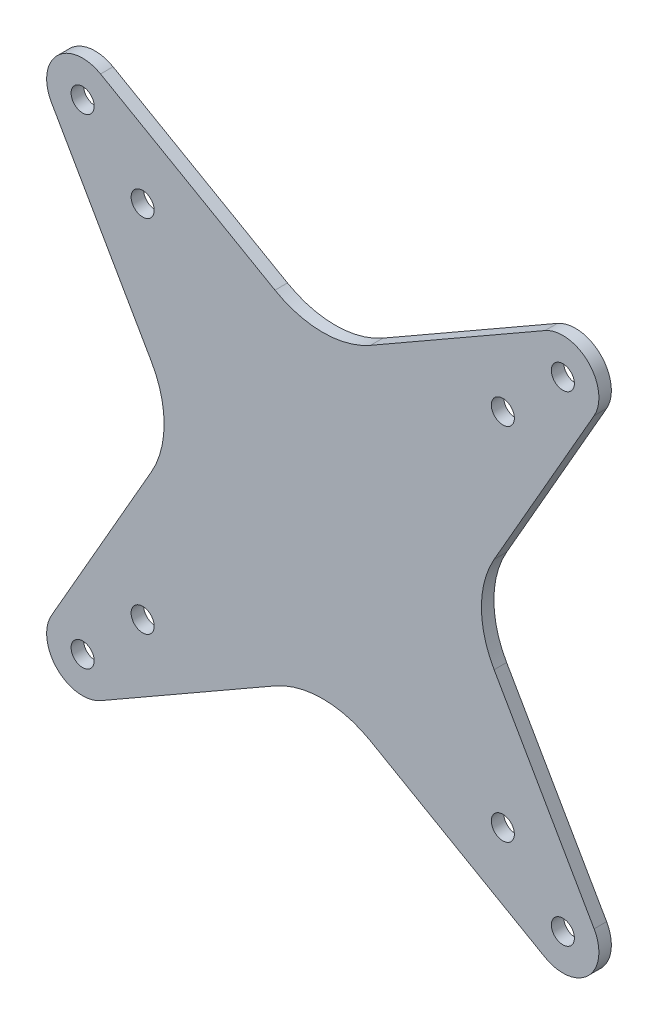
ISO-10303-21;
HEADER;
FILE_DESCRIPTION(('STEP AP214'),'2;1');
FILE_NAME('part.step','',(''),(''),'','','');
FILE_SCHEMA(('AUTOMOTIVE_DESIGN { 1 0 10303 214 1 1 1 1 }'));
ENDSEC;
DATA;
#1=APPLICATION_CONTEXT('core data for automotive mechanical design processes');
#2=APPLICATION_PROTOCOL_DEFINITION('international standard','automotive_design',2000,#1);
#3=PRODUCT_CONTEXT('',#1,'mechanical');
#4=PRODUCT('Part','Part','',(#3));
#5=PRODUCT_RELATED_PRODUCT_CATEGORY('part','',(#4));
#6=PRODUCT_DEFINITION_FORMATION('','',#4);
#7=PRODUCT_DEFINITION_CONTEXT('part definition',#1,'design');
#8=PRODUCT_DEFINITION('design','',#6,#7);
#9=PRODUCT_DEFINITION_SHAPE('','',#8);
#10=(LENGTH_UNIT() NAMED_UNIT(*) SI_UNIT(.MILLI.,.METRE.));
#11=(NAMED_UNIT(*) PLANE_ANGLE_UNIT() SI_UNIT($,.RADIAN.));
#12=(NAMED_UNIT(*) SI_UNIT($,.STERADIAN.) SOLID_ANGLE_UNIT());
#13=UNCERTAINTY_MEASURE_WITH_UNIT(LENGTH_MEASURE(1.E-05),#10,'distance_accuracy_value','');
#14=(GEOMETRIC_REPRESENTATION_CONTEXT(3) GLOBAL_UNCERTAINTY_ASSIGNED_CONTEXT((#13)) GLOBAL_UNIT_ASSIGNED_CONTEXT((#10,
#11,#12)) REPRESENTATION_CONTEXT('',''));
#15=CARTESIAN_POINT('',(0.,0.,0.));
#16=DIRECTION('',(0.,0.,1.));
#17=DIRECTION('',(1.,0.,0.));
#18=AXIS2_PLACEMENT_3D('',#15,#16,#17);
#19=CARTESIAN_POINT('',(0.,0.,2.6));
#20=DIRECTION('',(0.,0.,1.));
#21=DIRECTION('',(1.,0.,0.));
#22=AXIS2_PLACEMENT_3D('',#19,#20,#21);
#23=PLANE('',#22);
#24=CARTESIAN_POINT('',(-50.,50.,2.6));
#25=DIRECTION('',(0.,0.,-1.));
#26=DIRECTION('',(-1.,0.,0.));
#27=AXIS2_PLACEMENT_3D('',#24,#25,#26);
#28=CIRCLE('',#27,2.4);
#29=CARTESIAN_POINT('',(-52.4,50.,2.6));
#30=VERTEX_POINT('',#29);
#31=EDGE_CURVE('E316',#30,#30,#28,.T.);
#32=ORIENTED_EDGE('',*,*,#31,.T.);
#33=EDGE_LOOP('',(#32));
#34=FACE_BOUND('',#33,.T.);
#35=CARTESIAN_POINT('',(-37.5,37.5,2.6));
#36=DIRECTION('',(0.,0.,-1.));
#37=DIRECTION('',(-1.,0.,0.));
#38=AXIS2_PLACEMENT_3D('',#35,#36,#37);
#39=CIRCLE('',#38,2.4);
#40=CARTESIAN_POINT('',(-39.9,37.5,2.6));
#41=VERTEX_POINT('',#40);
#42=EDGE_CURVE('E326',#41,#41,#39,.T.);
#43=ORIENTED_EDGE('',*,*,#42,.T.);
#44=EDGE_LOOP('',(#43));
#45=FACE_BOUND('',#44,.T.);
#46=CARTESIAN_POINT('',(37.5,37.5,2.6));
#47=DIRECTION('',(0.,0.,-1.));
#48=DIRECTION('',(-1.,0.,0.));
#49=AXIS2_PLACEMENT_3D('',#46,#47,#48);
#50=CIRCLE('',#49,2.4);
#51=CARTESIAN_POINT('',(35.1,37.5,2.6));
#52=VERTEX_POINT('',#51);
#53=EDGE_CURVE('E332',#52,#52,#50,.T.);
#54=ORIENTED_EDGE('',*,*,#53,.T.);
#55=EDGE_LOOP('',(#54));
#56=FACE_BOUND('',#55,.T.);
#57=CARTESIAN_POINT('',(50.,50.,2.6));
#58=DIRECTION('',(0.,0.,-1.));
#59=DIRECTION('',(-1.,0.,0.));
#60=AXIS2_PLACEMENT_3D('',#57,#58,#59);
#61=CIRCLE('',#60,2.4);
#62=CARTESIAN_POINT('',(47.6,50.,2.6));
#63=VERTEX_POINT('',#62);
#64=EDGE_CURVE('E338',#63,#63,#61,.T.);
#65=ORIENTED_EDGE('',*,*,#64,.T.);
#66=EDGE_LOOP('',(#65));
#67=FACE_BOUND('',#66,.T.);
#68=CARTESIAN_POINT('',(50.,-50.,2.6));
#69=DIRECTION('',(0.,0.,-1.));
#70=DIRECTION('',(-1.,0.,0.));
#71=AXIS2_PLACEMENT_3D('',#68,#69,#70);
#72=CIRCLE('',#71,2.4);
#73=CARTESIAN_POINT('',(47.6,-50.,2.6));
#74=VERTEX_POINT('',#73);
#75=EDGE_CURVE('E344',#74,#74,#72,.T.);
#76=ORIENTED_EDGE('',*,*,#75,.T.);
#77=EDGE_LOOP('',(#76));
#78=FACE_BOUND('',#77,.T.);
#79=CARTESIAN_POINT('',(0.,-53.0330085889911,2.6));
#80=DIRECTION('',(0.,0.,1.));
#81=DIRECTION('',(1.,0.,0.));
#82=AXIS2_PLACEMENT_3D('',#79,#80,#81);
#83=CIRCLE('',#82,20.);
#84=CARTESIAN_POINT('',(9.94750286480512,-35.6822971697238,2.6));
#85=VERTEX_POINT('',#84);
#86=CARTESIAN_POINT('',(-9.94750286480512,-35.6822971697238,2.6));
#87=VERTEX_POINT('',#86);
#88=EDGE_CURVE('E224',#85,#87,#83,.T.);
#89=ORIENTED_EDGE('',*,*,#88,.F.);
#90=DIRECTION('',(-0.867535570963367,0.497375143240256,0.));
#91=VECTOR('',#90,1.);
#92=CARTESIAN_POINT('',(-12.9357433623348,-22.5628836828659,2.6));
#93=LINE('',#92,#91);
#94=CARTESIAN_POINT('',(46.2696864256981,-56.5065167822253,2.6));
#95=VERTEX_POINT('',#94);
#96=EDGE_CURVE('E262',#95,#85,#93,.T.);
#97=ORIENTED_EDGE('',*,*,#96,.F.);
#98=CARTESIAN_POINT('',(50.,-50.,2.6));
#99=DIRECTION('',(0.,0.,1.));
#100=DIRECTION('',(1.,0.,0.));
#101=AXIS2_PLACEMENT_3D('',#98,#99,#100);
#102=CIRCLE('',#101,7.50000000000001);
#103=CARTESIAN_POINT('',(56.5065167822252,-46.2696864256981,2.6));
#104=VERTEX_POINT('',#103);
#105=EDGE_CURVE('E252',#95,#104,#102,.T.);
#106=ORIENTED_EDGE('',*,*,#105,.T.);
#107=DIRECTION('',(0.497375143240257,-0.867535570963366,0.));
#108=VECTOR('',#107,1.);
#109=CARTESIAN_POINT('',(22.5628836828658,12.9357433623347,2.6));
#110=LINE('',#109,#108);
#111=CARTESIAN_POINT('',(35.6822971697237,-9.94750286480515,2.6));
#112=VERTEX_POINT('',#111);
#113=EDGE_CURVE('E367',#112,#104,#110,.T.);
#114=ORIENTED_EDGE('',*,*,#113,.F.);
#115=CARTESIAN_POINT('',(53.0330085889911,0.,2.6));
#116=DIRECTION('',(0.,0.,1.));
#117=DIRECTION('',(1.,0.,0.));
#118=AXIS2_PLACEMENT_3D('',#115,#116,#117);
#119=CIRCLE('',#118,20.);
#120=CARTESIAN_POINT('',(35.6822971697237,9.94750286480512,2.6));
#121=VERTEX_POINT('',#120);
#122=EDGE_CURVE('E370',#121,#112,#119,.T.);
#123=ORIENTED_EDGE('',*,*,#122,.F.);
#124=DIRECTION('',(-0.497375143240257,-0.867535570963367,0.));
#125=VECTOR('',#124,1.);
#126=CARTESIAN_POINT('',(22.5628836828659,-12.9357433623347,2.6));
#127=LINE('',#126,#125);
#128=CARTESIAN_POINT('',(56.5065167822252,46.2696864256981,2.6));
#129=VERTEX_POINT('',#128);
#130=EDGE_CURVE('E373',#129,#121,#127,.T.);
#131=ORIENTED_EDGE('',*,*,#130,.F.);
#132=CARTESIAN_POINT('',(50.,50.,2.6));
#133=DIRECTION('',(0.,0.,1.));
#134=DIRECTION('',(1.,0.,0.));
#135=AXIS2_PLACEMENT_3D('',#132,#133,#134);
#136=CIRCLE('',#135,7.5);
#137=CARTESIAN_POINT('',(46.2696864256981,56.5065167822253,2.6));
#138=VERTEX_POINT('',#137);
#139=EDGE_CURVE('E376',#129,#138,#136,.T.);
#140=ORIENTED_EDGE('',*,*,#139,.T.);
#141=DIRECTION('',(0.867535570963367,0.497375143240257,0.));
#142=VECTOR('',#141,1.);
#143=CARTESIAN_POINT('',(-12.9357433623348,22.5628836828659,2.6));
#144=LINE('',#143,#142);
#145=CARTESIAN_POINT('',(9.9475028648051,35.6822971697238,2.6));
#146=VERTEX_POINT('',#145);
#147=EDGE_CURVE('E378',#146,#138,#144,.T.);
#148=ORIENTED_EDGE('',*,*,#147,.F.);
#149=CARTESIAN_POINT('',(0.,53.0330085889911,2.6));
#150=DIRECTION('',(0.,0.,1.));
#151=DIRECTION('',(1.,0.,0.));
#152=AXIS2_PLACEMENT_3D('',#149,#150,#151);
#153=CIRCLE('',#152,20.);
#154=CARTESIAN_POINT('',(-9.94750286480517,35.6822971697238,2.6));
#155=VERTEX_POINT('',#154);
#156=EDGE_CURVE('E381',#155,#146,#153,.T.);
#157=ORIENTED_EDGE('',*,*,#156,.F.);
#158=DIRECTION('',(0.867535570963366,-0.497375143240257,0.));
#159=VECTOR('',#158,1.);
#160=CARTESIAN_POINT('',(12.9357433623347,22.5628836828658,2.6));
#161=LINE('',#160,#159);
#162=CARTESIAN_POINT('',(-46.2696864256981,56.5065167822253,2.6));
#163=VERTEX_POINT('',#162);
#164=EDGE_CURVE('E384',#163,#155,#161,.T.);
#165=ORIENTED_EDGE('',*,*,#164,.F.);
#166=CARTESIAN_POINT('',(-50.,50.,2.6));
#167=DIRECTION('',(0.,0.,1.));
#168=DIRECTION('',(1.,0.,0.));
#169=AXIS2_PLACEMENT_3D('',#166,#167,#168);
#170=CIRCLE('',#169,7.5);
#171=CARTESIAN_POINT('',(-56.5065167822253,46.2696864256981,2.6));
#172=VERTEX_POINT('',#171);
#173=EDGE_CURVE('E387',#163,#172,#170,.T.);
#174=ORIENTED_EDGE('',*,*,#173,.T.);
#175=DIRECTION('',(-0.497375143240257,0.867535570963366,0.));
#176=VECTOR('',#175,1.);
#177=CARTESIAN_POINT('',(-22.5628836828658,-12.9357433623347,2.6));
#178=LINE('',#177,#176);
#179=CARTESIAN_POINT('',(-35.6822971697237,9.94750286480513,2.6));
#180=VERTEX_POINT('',#179);
#181=EDGE_CURVE('E174',#180,#172,#178,.T.);
#182=ORIENTED_EDGE('',*,*,#181,.F.);
#183=CARTESIAN_POINT('',(-53.0330085889911,0.,2.6));
#184=DIRECTION('',(0.,0.,1.));
#185=DIRECTION('',(1.,0.,0.));
#186=AXIS2_PLACEMENT_3D('',#183,#184,#185);
#187=CIRCLE('',#186,20.);
#188=CARTESIAN_POINT('',(-35.6822971697238,-9.94750286480514,2.6));
#189=VERTEX_POINT('',#188);
#190=EDGE_CURVE('E172',#189,#180,#187,.T.);
#191=ORIENTED_EDGE('',*,*,#190,.F.);
#192=DIRECTION('',(0.497375143240257,0.867535570963366,0.));
#193=VECTOR('',#192,1.);
#194=CARTESIAN_POINT('',(-22.5628836828659,12.9357433623348,2.6));
#195=LINE('',#194,#193);
#196=CARTESIAN_POINT('',(-56.5065167822253,-46.2696864256981,2.6));
#197=VERTEX_POINT('',#196);
#198=EDGE_CURVE('E155',#197,#189,#195,.T.);
#199=ORIENTED_EDGE('',*,*,#198,.F.);
#200=CARTESIAN_POINT('',(-50.,-50.,2.6));
#201=DIRECTION('',(0.,0.,1.));
#202=DIRECTION('',(1.,0.,0.));
#203=AXIS2_PLACEMENT_3D('',#200,#201,#202);
#204=CIRCLE('',#203,7.5);
#205=CARTESIAN_POINT('',(-46.2696864256981,-56.5065167822252,2.6));
#206=VERTEX_POINT('',#205);
#207=EDGE_CURVE('E162',#197,#206,#204,.T.);
#208=ORIENTED_EDGE('',*,*,#207,.T.);
#209=DIRECTION('',(-0.867535570963367,-0.497375143240256,0.));
#210=VECTOR('',#209,1.);
#211=CARTESIAN_POINT('',(12.9357433623347,-22.5628836828659,2.6));
#212=LINE('',#211,#210);
#213=EDGE_CURVE('E166',#87,#206,#212,.T.);
#214=ORIENTED_EDGE('',*,*,#213,.F.);
#215=EDGE_LOOP('',(#89,#97,#106,#114,#123,#131,#140,#148,#157,#165,#174,#182,#191,#199,#208,#214));
#216=FACE_BOUND('',#215,.T.);
#217=CARTESIAN_POINT('',(-50.,-50.,2.6));
#218=DIRECTION('',(0.,0.,-1.));
#219=DIRECTION('',(-1.,0.,0.));
#220=AXIS2_PLACEMENT_3D('',#217,#218,#219);
#221=CIRCLE('',#220,2.4);
#222=CARTESIAN_POINT('',(-52.4,-50.,2.6));
#223=VERTEX_POINT('',#222);
#224=EDGE_CURVE('E182',#223,#223,#221,.T.);
#225=ORIENTED_EDGE('',*,*,#224,.T.);
#226=EDGE_LOOP('',(#225));
#227=FACE_BOUND('',#226,.T.);
#228=CARTESIAN_POINT('',(-37.5,-37.5,2.6));
#229=DIRECTION('',(0.,0.,-1.));
#230=DIRECTION('',(-1.,0.,0.));
#231=AXIS2_PLACEMENT_3D('',#228,#229,#230);
#232=CIRCLE('',#231,2.4);
#233=CARTESIAN_POINT('',(-39.9,-37.5,2.6));
#234=VERTEX_POINT('',#233);
#235=EDGE_CURVE('E356',#234,#234,#232,.T.);
#236=ORIENTED_EDGE('',*,*,#235,.T.);
#237=EDGE_LOOP('',(#236));
#238=FACE_BOUND('',#237,.T.);
#239=CARTESIAN_POINT('',(37.5,-37.5,2.6));
#240=DIRECTION('',(0.,0.,-1.));
#241=DIRECTION('',(-1.,0.,0.));
#242=AXIS2_PLACEMENT_3D('',#239,#240,#241);
#243=CIRCLE('',#242,2.4);
#244=CARTESIAN_POINT('',(35.1,-37.5,2.6));
#245=VERTEX_POINT('',#244);
#246=EDGE_CURVE('E350',#245,#245,#243,.T.);
#247=ORIENTED_EDGE('',*,*,#246,.T.);
#248=EDGE_LOOP('',(#247));
#249=FACE_BOUND('',#248,.T.);
#250=ADVANCED_FACE('F35',(#34,#45,#56,#67,#78,#216,#227,#238,#249),#23,.T.);
#251=CARTESIAN_POINT('',(0.,0.,0.));
#252=DIRECTION('',(0.,0.,1.));
#253=DIRECTION('',(1.,0.,0.));
#254=AXIS2_PLACEMENT_3D('',#251,#252,#253);
#255=PLANE('',#254);
#256=CARTESIAN_POINT('',(-50.,50.,0.));
#257=DIRECTION('',(0.,0.,-1.));
#258=DIRECTION('',(-1.,0.,0.));
#259=AXIS2_PLACEMENT_3D('',#256,#257,#258);
#260=CIRCLE('',#259,2.4);
#261=CARTESIAN_POINT('',(-52.4,50.,0.));
#262=VERTEX_POINT('',#261);
#263=EDGE_CURVE('E319',#262,#262,#260,.T.);
#264=ORIENTED_EDGE('',*,*,#263,.F.);
#265=EDGE_LOOP('',(#264));
#266=FACE_BOUND('',#265,.T.);
#267=CARTESIAN_POINT('',(-37.5,37.5,0.));
#268=DIRECTION('',(0.,0.,-1.));
#269=DIRECTION('',(-1.,0.,0.));
#270=AXIS2_PLACEMENT_3D('',#267,#268,#269);
#271=CIRCLE('',#270,2.4);
#272=CARTESIAN_POINT('',(-39.9,37.5,0.));
#273=VERTEX_POINT('',#272);
#274=EDGE_CURVE('E321',#273,#273,#271,.T.);
#275=ORIENTED_EDGE('',*,*,#274,.F.);
#276=EDGE_LOOP('',(#275));
#277=FACE_BOUND('',#276,.T.);
#278=CARTESIAN_POINT('',(37.5,37.5,0.));
#279=DIRECTION('',(0.,0.,-1.));
#280=DIRECTION('',(-1.,0.,0.));
#281=AXIS2_PLACEMENT_3D('',#278,#279,#280);
#282=CIRCLE('',#281,2.4);
#283=CARTESIAN_POINT('',(35.1,37.5,0.));
#284=VERTEX_POINT('',#283);
#285=EDGE_CURVE('E329',#284,#284,#282,.T.);
#286=ORIENTED_EDGE('',*,*,#285,.F.);
#287=EDGE_LOOP('',(#286));
#288=FACE_BOUND('',#287,.T.);
#289=CARTESIAN_POINT('',(50.,50.,0.));
#290=DIRECTION('',(0.,0.,-1.));
#291=DIRECTION('',(-1.,0.,0.));
#292=AXIS2_PLACEMENT_3D('',#289,#290,#291);
#293=CIRCLE('',#292,2.4);
#294=CARTESIAN_POINT('',(47.6,50.,0.));
#295=VERTEX_POINT('',#294);
#296=EDGE_CURVE('E335',#295,#295,#293,.T.);
#297=ORIENTED_EDGE('',*,*,#296,.F.);
#298=EDGE_LOOP('',(#297));
#299=FACE_BOUND('',#298,.T.);
#300=CARTESIAN_POINT('',(50.,-50.,0.));
#301=DIRECTION('',(0.,0.,-1.));
#302=DIRECTION('',(-1.,0.,0.));
#303=AXIS2_PLACEMENT_3D('',#300,#301,#302);
#304=CIRCLE('',#303,2.4);
#305=CARTESIAN_POINT('',(47.6,-50.,0.));
#306=VERTEX_POINT('',#305);
#307=EDGE_CURVE('E341',#306,#306,#304,.T.);
#308=ORIENTED_EDGE('',*,*,#307,.F.);
#309=EDGE_LOOP('',(#308));
#310=FACE_BOUND('',#309,.T.);
#311=CARTESIAN_POINT('',(37.5,-37.5,0.));
#312=DIRECTION('',(0.,0.,-1.));
#313=DIRECTION('',(-1.,0.,0.));
#314=AXIS2_PLACEMENT_3D('',#311,#312,#313);
#315=CIRCLE('',#314,2.4);
#316=CARTESIAN_POINT('',(35.1,-37.5,0.));
#317=VERTEX_POINT('',#316);
#318=EDGE_CURVE('E347',#317,#317,#315,.T.);
#319=ORIENTED_EDGE('',*,*,#318,.F.);
#320=EDGE_LOOP('',(#319));
#321=FACE_BOUND('',#320,.T.);
#322=CARTESIAN_POINT('',(-37.5,-37.5,0.));
#323=DIRECTION('',(0.,0.,-1.));
#324=DIRECTION('',(-1.,0.,0.));
#325=AXIS2_PLACEMENT_3D('',#322,#323,#324);
#326=CIRCLE('',#325,2.4);
#327=CARTESIAN_POINT('',(-39.9,-37.5,0.));
#328=VERTEX_POINT('',#327);
#329=EDGE_CURVE('E353',#328,#328,#326,.T.);
#330=ORIENTED_EDGE('',*,*,#329,.F.);
#331=EDGE_LOOP('',(#330));
#332=FACE_BOUND('',#331,.T.);
#333=CARTESIAN_POINT('',(0.,-53.0330085889911,0.));
#334=DIRECTION('',(0.,0.,1.));
#335=DIRECTION('',(1.,0.,0.));
#336=AXIS2_PLACEMENT_3D('',#333,#334,#335);
#337=CIRCLE('',#336,20.);
#338=CARTESIAN_POINT('',(9.94750286480512,-35.6822971697238,0.));
#339=VERTEX_POINT('',#338);
#340=CARTESIAN_POINT('',(-9.94750286480512,-35.6822971697238,0.));
#341=VERTEX_POINT('',#340);
#342=EDGE_CURVE('E179',#339,#341,#337,.T.);
#343=ORIENTED_EDGE('',*,*,#342,.T.);
#344=DIRECTION('',(-0.867535570963367,-0.497375143240256,0.));
#345=VECTOR('',#344,1.);
#346=CARTESIAN_POINT('',(12.9357433623347,-22.5628836828659,0.));
#347=LINE('',#346,#345);
#348=CARTESIAN_POINT('',(-46.2696864256981,-56.5065167822252,0.));
#349=VERTEX_POINT('',#348);
#350=EDGE_CURVE('E221',#341,#349,#347,.T.);
#351=ORIENTED_EDGE('',*,*,#350,.T.);
#352=CARTESIAN_POINT('',(-50.,-50.,0.));
#353=DIRECTION('',(0.,0.,1.));
#354=DIRECTION('',(1.,0.,0.));
#355=AXIS2_PLACEMENT_3D('',#352,#353,#354);
#356=CIRCLE('',#355,7.5);
#357=CARTESIAN_POINT('',(-56.5065167822253,-46.2696864256981,0.));
#358=VERTEX_POINT('',#357);
#359=EDGE_CURVE('E219',#358,#349,#356,.T.);
#360=ORIENTED_EDGE('',*,*,#359,.F.);
#361=DIRECTION('',(0.497375143240257,0.867535570963366,0.));
#362=VECTOR('',#361,1.);
#363=CARTESIAN_POINT('',(-22.5628836828659,12.9357433623348,0.));
#364=LINE('',#363,#362);
#365=CARTESIAN_POINT('',(-35.6822971697238,-9.94750286480514,0.));
#366=VERTEX_POINT('',#365);
#367=EDGE_CURVE('E157',#358,#366,#364,.T.);
#368=ORIENTED_EDGE('',*,*,#367,.T.);
#369=CARTESIAN_POINT('',(-53.0330085889911,0.,0.));
#370=DIRECTION('',(0.,0.,1.));
#371=DIRECTION('',(1.,0.,0.));
#372=AXIS2_PLACEMENT_3D('',#369,#370,#371);
#373=CIRCLE('',#372,20.);
#374=CARTESIAN_POINT('',(-35.6822971697237,9.94750286480513,0.));
#375=VERTEX_POINT('',#374);
#376=EDGE_CURVE('E215',#366,#375,#373,.T.);
#377=ORIENTED_EDGE('',*,*,#376,.T.);
#378=DIRECTION('',(-0.497375143240257,0.867535570963366,0.));
#379=VECTOR('',#378,1.);
#380=CARTESIAN_POINT('',(-22.5628836828658,-12.9357433623347,0.));
#381=LINE('',#380,#379);
#382=CARTESIAN_POINT('',(-56.5065167822253,46.2696864256981,0.));
#383=VERTEX_POINT('',#382);
#384=EDGE_CURVE('E212',#375,#383,#381,.T.);
#385=ORIENTED_EDGE('',*,*,#384,.T.);
#386=CARTESIAN_POINT('',(-50.,50.,0.));
#387=DIRECTION('',(0.,0.,1.));
#388=DIRECTION('',(1.,0.,0.));
#389=AXIS2_PLACEMENT_3D('',#386,#387,#388);
#390=CIRCLE('',#389,7.5);
#391=CARTESIAN_POINT('',(-46.2696864256981,56.5065167822253,0.));
#392=VERTEX_POINT('',#391);
#393=EDGE_CURVE('E209',#392,#383,#390,.T.);
#394=ORIENTED_EDGE('',*,*,#393,.F.);
#395=DIRECTION('',(0.867535570963366,-0.497375143240257,0.));
#396=VECTOR('',#395,1.);
#397=CARTESIAN_POINT('',(12.9357433623347,22.5628836828658,0.));
#398=LINE('',#397,#396);
#399=CARTESIAN_POINT('',(-9.94750286480517,35.6822971697238,0.));
#400=VERTEX_POINT('',#399);
#401=EDGE_CURVE('E206',#392,#400,#398,.T.);
#402=ORIENTED_EDGE('',*,*,#401,.T.);
#403=CARTESIAN_POINT('',(0.,53.0330085889911,0.));
#404=DIRECTION('',(0.,0.,1.));
#405=DIRECTION('',(1.,0.,0.));
#406=AXIS2_PLACEMENT_3D('',#403,#404,#405);
#407=CIRCLE('',#406,20.);
#408=CARTESIAN_POINT('',(9.9475028648051,35.6822971697238,0.));
#409=VERTEX_POINT('',#408);
#410=EDGE_CURVE('E203',#400,#409,#407,.T.);
#411=ORIENTED_EDGE('',*,*,#410,.T.);
#412=DIRECTION('',(0.867535570963367,0.497375143240257,0.));
#413=VECTOR('',#412,1.);
#414=CARTESIAN_POINT('',(-12.9357433623348,22.5628836828659,0.));
#415=LINE('',#414,#413);
#416=CARTESIAN_POINT('',(46.2696864256981,56.5065167822253,0.));
#417=VERTEX_POINT('',#416);
#418=EDGE_CURVE('E200',#409,#417,#415,.T.);
#419=ORIENTED_EDGE('',*,*,#418,.T.);
#420=CARTESIAN_POINT('',(50.,50.,0.));
#421=DIRECTION('',(0.,0.,1.));
#422=DIRECTION('',(1.,0.,0.));
#423=AXIS2_PLACEMENT_3D('',#420,#421,#422);
#424=CIRCLE('',#423,7.5);
#425=CARTESIAN_POINT('',(56.5065167822252,46.2696864256981,0.));
#426=VERTEX_POINT('',#425);
#427=EDGE_CURVE('E197',#426,#417,#424,.T.);
#428=ORIENTED_EDGE('',*,*,#427,.F.);
#429=DIRECTION('',(-0.497375143240257,-0.867535570963367,0.));
#430=VECTOR('',#429,1.);
#431=CARTESIAN_POINT('',(22.5628836828659,-12.9357433623347,0.));
#432=LINE('',#431,#430);
#433=CARTESIAN_POINT('',(35.6822971697237,9.94750286480512,0.));
#434=VERTEX_POINT('',#433);
#435=EDGE_CURVE('E194',#426,#434,#432,.T.);
#436=ORIENTED_EDGE('',*,*,#435,.T.);
#437=CARTESIAN_POINT('',(53.0330085889911,0.,0.));
#438=DIRECTION('',(0.,0.,1.));
#439=DIRECTION('',(1.,0.,0.));
#440=AXIS2_PLACEMENT_3D('',#437,#438,#439);
#441=CIRCLE('',#440,20.);
#442=CARTESIAN_POINT('',(35.6822971697237,-9.94750286480515,0.));
#443=VERTEX_POINT('',#442);
#444=EDGE_CURVE('E191',#434,#443,#441,.T.);
#445=ORIENTED_EDGE('',*,*,#444,.T.);
#446=DIRECTION('',(0.497375143240257,-0.867535570963366,0.));
#447=VECTOR('',#446,1.);
#448=CARTESIAN_POINT('',(22.5628836828658,12.9357433623347,0.));
#449=LINE('',#448,#447);
#450=CARTESIAN_POINT('',(56.5065167822252,-46.2696864256981,0.));
#451=VERTEX_POINT('',#450);
#452=EDGE_CURVE('E188',#443,#451,#449,.T.);
#453=ORIENTED_EDGE('',*,*,#452,.T.);
#454=CARTESIAN_POINT('',(50.,-50.,0.));
#455=DIRECTION('',(0.,0.,1.));
#456=DIRECTION('',(1.,0.,0.));
#457=AXIS2_PLACEMENT_3D('',#454,#455,#456);
#458=CIRCLE('',#457,7.50000000000001);
#459=CARTESIAN_POINT('',(46.2696864256981,-56.5065167822253,0.));
#460=VERTEX_POINT('',#459);
#461=EDGE_CURVE('E185',#460,#451,#458,.T.);
#462=ORIENTED_EDGE('',*,*,#461,.F.);
#463=DIRECTION('',(-0.867535570963367,0.497375143240256,0.));
#464=VECTOR('',#463,1.);
#465=CARTESIAN_POINT('',(-12.9357433623348,-22.5628836828659,0.));
#466=LINE('',#465,#464);
#467=EDGE_CURVE('E181',#460,#339,#466,.T.);
#468=ORIENTED_EDGE('',*,*,#467,.T.);
#469=EDGE_LOOP('',(#343,#351,#360,#368,#377,#385,#394,#402,#411,#419,#428,#436,#445,#453,#462,#468));
#470=FACE_BOUND('',#469,.T.);
#471=CARTESIAN_POINT('',(-50.,-50.,0.));
#472=DIRECTION('',(0.,0.,-1.));
#473=DIRECTION('',(-1.,0.,0.));
#474=AXIS2_PLACEMENT_3D('',#471,#472,#473);
#475=CIRCLE('',#474,2.4);
#476=CARTESIAN_POINT('',(-52.4,-50.,0.));
#477=VERTEX_POINT('',#476);
#478=EDGE_CURVE('E359',#477,#477,#475,.T.);
#479=ORIENTED_EDGE('',*,*,#478,.F.);
#480=EDGE_LOOP('',(#479));
#481=FACE_BOUND('',#480,.T.);
#482=ADVANCED_FACE('F258',(#266,#277,#288,#299,#310,#321,#332,#470,#481),#255,.F.);
#483=CARTESIAN_POINT('',(0.,-53.0330085889911,2.6));
#484=DIRECTION('',(0.,0.,-1.));
#485=DIRECTION('',(-1.,0.,0.));
#486=AXIS2_PLACEMENT_3D('',#483,#484,#485);
#487=CYLINDRICAL_SURFACE('',#486,20.);
#488=ORIENTED_EDGE('',*,*,#342,.F.);
#489=DIRECTION('',(0.,0.,-1.));
#490=VECTOR('',#489,1.);
#491=CARTESIAN_POINT('',(9.94750286480512,-35.6822971697238,2.6));
#492=LINE('',#491,#490);
#493=EDGE_CURVE('E11',#85,#339,#492,.T.);
#494=ORIENTED_EDGE('',*,*,#493,.F.);
#495=ORIENTED_EDGE('',*,*,#88,.T.);
#496=DIRECTION('',(0.,0.,-1.));
#497=VECTOR('',#496,1.);
#498=CARTESIAN_POINT('',(-9.94750286480512,-35.6822971697238,2.6));
#499=LINE('',#498,#497);
#500=EDGE_CURVE('E52',#87,#341,#499,.T.);
#501=ORIENTED_EDGE('',*,*,#500,.T.);
#502=EDGE_LOOP('',(#488,#494,#495,#501));
#503=FACE_BOUND('',#502,.T.);
#504=ADVANCED_FACE('F37',(#503),#487,.F.);
#505=CARTESIAN_POINT('',(-12.9357433623348,-22.5628836828659,2.6));
#506=DIRECTION('',(-0.497375143240256,-0.867535570963367,0.));
#507=DIRECTION('',(0.867535570963367,-0.497375143240256,0.));
#508=AXIS2_PLACEMENT_3D('',#505,#506,#507);
#509=PLANE('',#508);
#510=ORIENTED_EDGE('',*,*,#467,.F.);
#511=DIRECTION('',(0.,0.,-1.));
#512=VECTOR('',#511,1.);
#513=CARTESIAN_POINT('',(46.2696864256981,-56.5065167822253,2.6));
#514=LINE('',#513,#512);
#515=EDGE_CURVE('E44',#95,#460,#514,.T.);
#516=ORIENTED_EDGE('',*,*,#515,.F.);
#517=ORIENTED_EDGE('',*,*,#96,.T.);
#518=ORIENTED_EDGE('',*,*,#493,.T.);
#519=EDGE_LOOP('',(#510,#516,#517,#518));
#520=FACE_BOUND('',#519,.T.);
#521=ADVANCED_FACE('F261',(#520),#509,.T.);
#522=CARTESIAN_POINT('',(50.,-50.,2.6));
#523=DIRECTION('',(0.,0.,-1.));
#524=DIRECTION('',(-1.,0.,0.));
#525=AXIS2_PLACEMENT_3D('',#522,#523,#524);
#526=CYLINDRICAL_SURFACE('',#525,7.50000000000001);
#527=ORIENTED_EDGE('',*,*,#461,.T.);
#528=DIRECTION('',(0.,0.,-1.));
#529=VECTOR('',#528,1.);
#530=CARTESIAN_POINT('',(56.5065167822252,-46.2696864256981,2.6));
#531=LINE('',#530,#529);
#532=EDGE_CURVE('E246',#104,#451,#531,.T.);
#533=ORIENTED_EDGE('',*,*,#532,.F.);
#534=ORIENTED_EDGE('',*,*,#105,.F.);
#535=ORIENTED_EDGE('',*,*,#515,.T.);
#536=EDGE_LOOP('',(#527,#533,#534,#535));
#537=FACE_BOUND('',#536,.T.);
#538=ADVANCED_FACE('F250',(#537),#526,.T.);
#539=CARTESIAN_POINT('',(22.5628836828658,12.9357433623347,2.6));
#540=DIRECTION('',(0.867535570963366,0.497375143240257,0.));
#541=DIRECTION('',(-0.497375143240257,0.867535570963366,0.));
#542=AXIS2_PLACEMENT_3D('',#539,#540,#541);
#543=PLANE('',#542);
#544=ORIENTED_EDGE('',*,*,#452,.F.);
#545=DIRECTION('',(0.,0.,-1.));
#546=VECTOR('',#545,1.);
#547=CARTESIAN_POINT('',(35.6822971697237,-9.94750286480515,2.6));
#548=LINE('',#547,#546);
#549=EDGE_CURVE('E244',#112,#443,#548,.T.);
#550=ORIENTED_EDGE('',*,*,#549,.F.);
#551=ORIENTED_EDGE('',*,*,#113,.T.);
#552=ORIENTED_EDGE('',*,*,#532,.T.);
#553=EDGE_LOOP('',(#544,#550,#551,#552));
#554=FACE_BOUND('',#553,.T.);
#555=ADVANCED_FACE('F426',(#554),#543,.T.);
#556=CARTESIAN_POINT('',(53.0330085889911,0.,2.6));
#557=DIRECTION('',(0.,0.,-1.));
#558=DIRECTION('',(-1.,0.,0.));
#559=AXIS2_PLACEMENT_3D('',#556,#557,#558);
#560=CYLINDRICAL_SURFACE('',#559,20.);
#561=ORIENTED_EDGE('',*,*,#444,.F.);
#562=DIRECTION('',(0.,0.,-1.));
#563=VECTOR('',#562,1.);
#564=CARTESIAN_POINT('',(35.6822971697237,9.94750286480512,2.6));
#565=LINE('',#564,#563);
#566=EDGE_CURVE('E242',#121,#434,#565,.T.);
#567=ORIENTED_EDGE('',*,*,#566,.F.);
#568=ORIENTED_EDGE('',*,*,#122,.T.);
#569=ORIENTED_EDGE('',*,*,#549,.T.);
#570=EDGE_LOOP('',(#561,#567,#568,#569));
#571=FACE_BOUND('',#570,.T.);
#572=ADVANCED_FACE('F422',(#571),#560,.F.);
#573=CARTESIAN_POINT('',(22.5628836828659,-12.9357433623347,2.6));
#574=DIRECTION('',(0.867535570963367,-0.497375143240257,0.));
#575=DIRECTION('',(0.497375143240257,0.867535570963367,0.));
#576=AXIS2_PLACEMENT_3D('',#573,#574,#575);
#577=PLANE('',#576);
#578=ORIENTED_EDGE('',*,*,#435,.F.);
#579=DIRECTION('',(0.,0.,-1.));
#580=VECTOR('',#579,1.);
#581=CARTESIAN_POINT('',(56.5065167822252,46.2696864256981,2.6));
#582=LINE('',#581,#580);
#583=EDGE_CURVE('E240',#129,#426,#582,.T.);
#584=ORIENTED_EDGE('',*,*,#583,.F.);
#585=ORIENTED_EDGE('',*,*,#130,.T.);
#586=ORIENTED_EDGE('',*,*,#566,.T.);
#587=EDGE_LOOP('',(#578,#584,#585,#586));
#588=FACE_BOUND('',#587,.T.);
#589=ADVANCED_FACE('F419',(#588),#577,.T.);
#590=CARTESIAN_POINT('',(50.,50.,2.6));
#591=DIRECTION('',(0.,0.,-1.));
#592=DIRECTION('',(-1.,0.,0.));
#593=AXIS2_PLACEMENT_3D('',#590,#591,#592);
#594=CYLINDRICAL_SURFACE('',#593,7.5);
#595=ORIENTED_EDGE('',*,*,#427,.T.);
#596=DIRECTION('',(0.,0.,-1.));
#597=VECTOR('',#596,1.);
#598=CARTESIAN_POINT('',(46.2696864256981,56.5065167822253,2.6));
#599=LINE('',#598,#597);
#600=EDGE_CURVE('E238',#138,#417,#599,.T.);
#601=ORIENTED_EDGE('',*,*,#600,.F.);
#602=ORIENTED_EDGE('',*,*,#139,.F.);
#603=ORIENTED_EDGE('',*,*,#583,.T.);
#604=EDGE_LOOP('',(#595,#601,#602,#603));
#605=FACE_BOUND('',#604,.T.);
#606=ADVANCED_FACE('F416',(#605),#594,.T.);
#607=CARTESIAN_POINT('',(-12.9357433623348,22.5628836828659,2.6));
#608=DIRECTION('',(-0.497375143240257,0.867535570963367,0.));
#609=DIRECTION('',(-0.867535570963367,-0.497375143240257,0.));
#610=AXIS2_PLACEMENT_3D('',#607,#608,#609);
#611=PLANE('',#610);
#612=ORIENTED_EDGE('',*,*,#418,.F.);
#613=DIRECTION('',(0.,0.,-1.));
#614=VECTOR('',#613,1.);
#615=CARTESIAN_POINT('',(9.9475028648051,35.6822971697238,2.6));
#616=LINE('',#615,#614);
#617=EDGE_CURVE('E236',#146,#409,#616,.T.);
#618=ORIENTED_EDGE('',*,*,#617,.F.);
#619=ORIENTED_EDGE('',*,*,#147,.T.);
#620=ORIENTED_EDGE('',*,*,#600,.T.);
#621=EDGE_LOOP('',(#612,#618,#619,#620));
#622=FACE_BOUND('',#621,.T.);
#623=ADVANCED_FACE('F411',(#622),#611,.T.);
#624=CARTESIAN_POINT('',(0.,53.0330085889911,2.6));
#625=DIRECTION('',(0.,0.,-1.));
#626=DIRECTION('',(-1.,0.,0.));
#627=AXIS2_PLACEMENT_3D('',#624,#625,#626);
#628=CYLINDRICAL_SURFACE('',#627,20.);
#629=ORIENTED_EDGE('',*,*,#410,.F.);
#630=DIRECTION('',(0.,0.,-1.));
#631=VECTOR('',#630,1.);
#632=CARTESIAN_POINT('',(-9.94750286480517,35.6822971697238,2.6));
#633=LINE('',#632,#631);
#634=EDGE_CURVE('E234',#155,#400,#633,.T.);
#635=ORIENTED_EDGE('',*,*,#634,.F.);
#636=ORIENTED_EDGE('',*,*,#156,.T.);
#637=ORIENTED_EDGE('',*,*,#617,.T.);
#638=EDGE_LOOP('',(#629,#635,#636,#637));
#639=FACE_BOUND('',#638,.T.);
#640=ADVANCED_FACE('F406',(#639),#628,.F.);
#641=CARTESIAN_POINT('',(12.9357433623347,22.5628836828658,2.6));
#642=DIRECTION('',(0.497375143240257,0.867535570963366,0.));
#643=DIRECTION('',(-0.867535570963366,0.497375143240257,0.));
#644=AXIS2_PLACEMENT_3D('',#641,#642,#643);
#645=PLANE('',#644);
#646=ORIENTED_EDGE('',*,*,#401,.F.);
#647=DIRECTION('',(0.,0.,-1.));
#648=VECTOR('',#647,1.);
#649=CARTESIAN_POINT('',(-46.2696864256981,56.5065167822253,2.6));
#650=LINE('',#649,#648);
#651=EDGE_CURVE('E232',#163,#392,#650,.T.);
#652=ORIENTED_EDGE('',*,*,#651,.F.);
#653=ORIENTED_EDGE('',*,*,#164,.T.);
#654=ORIENTED_EDGE('',*,*,#634,.T.);
#655=EDGE_LOOP('',(#646,#652,#653,#654));
#656=FACE_BOUND('',#655,.T.);
#657=ADVANCED_FACE('F402',(#656),#645,.T.);
#658=CARTESIAN_POINT('',(-50.,50.,2.6));
#659=DIRECTION('',(0.,0.,-1.));
#660=DIRECTION('',(-1.,0.,0.));
#661=AXIS2_PLACEMENT_3D('',#658,#659,#660);
#662=CYLINDRICAL_SURFACE('',#661,7.5);
#663=ORIENTED_EDGE('',*,*,#393,.T.);
#664=DIRECTION('',(0.,0.,-1.));
#665=VECTOR('',#664,1.);
#666=CARTESIAN_POINT('',(-56.5065167822253,46.2696864256981,2.6));
#667=LINE('',#666,#665);
#668=EDGE_CURVE('E230',#172,#383,#667,.T.);
#669=ORIENTED_EDGE('',*,*,#668,.F.);
#670=ORIENTED_EDGE('',*,*,#173,.F.);
#671=ORIENTED_EDGE('',*,*,#651,.T.);
#672=EDGE_LOOP('',(#663,#669,#670,#671));
#673=FACE_BOUND('',#672,.T.);
#674=ADVANCED_FACE('F531',(#673),#662,.T.);
#675=CARTESIAN_POINT('',(-22.5628836828658,-12.9357433623347,2.6));
#676=DIRECTION('',(-0.867535570963366,-0.497375143240257,0.));
#677=DIRECTION('',(0.497375143240257,-0.867535570963366,0.));
#678=AXIS2_PLACEMENT_3D('',#675,#676,#677);
#679=PLANE('',#678);
#680=ORIENTED_EDGE('',*,*,#384,.F.);
#681=DIRECTION('',(0.,0.,-1.));
#682=VECTOR('',#681,1.);
#683=CARTESIAN_POINT('',(-35.6822971697237,9.94750286480513,2.6));
#684=LINE('',#683,#682);
#685=EDGE_CURVE('E228',#180,#375,#684,.T.);
#686=ORIENTED_EDGE('',*,*,#685,.F.);
#687=ORIENTED_EDGE('',*,*,#181,.T.);
#688=ORIENTED_EDGE('',*,*,#668,.T.);
#689=EDGE_LOOP('',(#680,#686,#687,#688));
#690=FACE_BOUND('',#689,.T.);
#691=ADVANCED_FACE('F391',(#690),#679,.T.);
#692=CARTESIAN_POINT('',(-53.0330085889911,0.,2.6));
#693=DIRECTION('',(0.,0.,-1.));
#694=DIRECTION('',(-1.,0.,0.));
#695=AXIS2_PLACEMENT_3D('',#692,#693,#694);
#696=CYLINDRICAL_SURFACE('',#695,20.);
#697=ORIENTED_EDGE('',*,*,#376,.F.);
#698=DIRECTION('',(0.,0.,-1.));
#699=VECTOR('',#698,1.);
#700=CARTESIAN_POINT('',(-35.6822971697238,-9.94750286480514,2.6));
#701=LINE('',#700,#699);
#702=EDGE_CURVE('E160',#189,#366,#701,.T.);
#703=ORIENTED_EDGE('',*,*,#702,.F.);
#704=ORIENTED_EDGE('',*,*,#190,.T.);
#705=ORIENTED_EDGE('',*,*,#685,.T.);
#706=EDGE_LOOP('',(#697,#703,#704,#705));
#707=FACE_BOUND('',#706,.T.);
#708=ADVANCED_FACE('F397',(#707),#696,.F.);
#709=CARTESIAN_POINT('',(-22.5628836828659,12.9357433623348,2.6));
#710=DIRECTION('',(-0.867535570963366,0.497375143240257,0.));
#711=DIRECTION('',(-0.497375143240257,-0.867535570963366,0.));
#712=AXIS2_PLACEMENT_3D('',#709,#710,#711);
#713=PLANE('',#712);
#714=ORIENTED_EDGE('',*,*,#367,.F.);
#715=DIRECTION('',(0.,0.,-1.));
#716=VECTOR('',#715,1.);
#717=CARTESIAN_POINT('',(-56.5065167822253,-46.2696864256981,2.6));
#718=LINE('',#717,#716);
#719=EDGE_CURVE('E151',#197,#358,#718,.T.);
#720=ORIENTED_EDGE('',*,*,#719,.F.);
#721=ORIENTED_EDGE('',*,*,#198,.T.);
#722=ORIENTED_EDGE('',*,*,#702,.T.);
#723=EDGE_LOOP('',(#714,#720,#721,#722));
#724=FACE_BOUND('',#723,.T.);
#725=ADVANCED_FACE('F153',(#724),#713,.T.);
#726=CARTESIAN_POINT('',(-50.,-50.,2.6));
#727=DIRECTION('',(0.,0.,-1.));
#728=DIRECTION('',(-1.,0.,0.));
#729=AXIS2_PLACEMENT_3D('',#726,#727,#728);
#730=CYLINDRICAL_SURFACE('',#729,7.5);
#731=ORIENTED_EDGE('',*,*,#359,.T.);
#732=DIRECTION('',(0.,0.,-1.));
#733=VECTOR('',#732,1.);
#734=CARTESIAN_POINT('',(-46.2696864256981,-56.5065167822252,2.6));
#735=LINE('',#734,#733);
#736=EDGE_CURVE('E102',#206,#349,#735,.T.);
#737=ORIENTED_EDGE('',*,*,#736,.F.);
#738=ORIENTED_EDGE('',*,*,#207,.F.);
#739=ORIENTED_EDGE('',*,*,#719,.T.);
#740=EDGE_LOOP('',(#731,#737,#738,#739));
#741=FACE_BOUND('',#740,.T.);
#742=ADVANCED_FACE('F163',(#741),#730,.T.);
#743=CARTESIAN_POINT('',(12.9357433623347,-22.5628836828659,2.6));
#744=DIRECTION('',(0.497375143240256,-0.867535570963367,0.));
#745=DIRECTION('',(0.867535570963367,0.497375143240256,0.));
#746=AXIS2_PLACEMENT_3D('',#743,#744,#745);
#747=PLANE('',#746);
#748=ORIENTED_EDGE('',*,*,#350,.F.);
#749=ORIENTED_EDGE('',*,*,#500,.F.);
#750=ORIENTED_EDGE('',*,*,#213,.T.);
#751=ORIENTED_EDGE('',*,*,#736,.T.);
#752=EDGE_LOOP('',(#748,#749,#750,#751));
#753=FACE_BOUND('',#752,.T.);
#754=ADVANCED_FACE('F263',(#753),#747,.T.);
#755=CARTESIAN_POINT('',(-50.,-50.,0.));
#756=DIRECTION('',(0.,0.,-1.));
#757=DIRECTION('',(-1.,0.,0.));
#758=AXIS2_PLACEMENT_3D('',#755,#756,#757);
#759=CYLINDRICAL_SURFACE('',#758,2.4);
#760=ORIENTED_EDGE('',*,*,#224,.F.);
#761=EDGE_LOOP('',(#760));
#762=FACE_BOUND('',#761,.T.);
#763=ORIENTED_EDGE('',*,*,#478,.T.);
#764=EDGE_LOOP('',(#763));
#765=FACE_BOUND('',#764,.T.);
#766=ADVANCED_FACE('F265',(#762,#765),#759,.F.);
#767=CARTESIAN_POINT('',(-37.5,-37.5,0.));
#768=DIRECTION('',(0.,0.,-1.));
#769=DIRECTION('',(-1.,0.,0.));
#770=AXIS2_PLACEMENT_3D('',#767,#768,#769);
#771=CYLINDRICAL_SURFACE('',#770,2.4);
#772=ORIENTED_EDGE('',*,*,#235,.F.);
#773=EDGE_LOOP('',(#772));
#774=FACE_BOUND('',#773,.T.);
#775=ORIENTED_EDGE('',*,*,#329,.T.);
#776=EDGE_LOOP('',(#775));
#777=FACE_BOUND('',#776,.T.);
#778=ADVANCED_FACE('F271',(#774,#777),#771,.F.);
#779=CARTESIAN_POINT('',(37.5,-37.5,0.));
#780=DIRECTION('',(0.,0.,-1.));
#781=DIRECTION('',(-1.,0.,0.));
#782=AXIS2_PLACEMENT_3D('',#779,#780,#781);
#783=CYLINDRICAL_SURFACE('',#782,2.4);
#784=ORIENTED_EDGE('',*,*,#246,.F.);
#785=EDGE_LOOP('',(#784));
#786=FACE_BOUND('',#785,.T.);
#787=ORIENTED_EDGE('',*,*,#318,.T.);
#788=EDGE_LOOP('',(#787));
#789=FACE_BOUND('',#788,.T.);
#790=ADVANCED_FACE('F288',(#786,#789),#783,.F.);
#791=CARTESIAN_POINT('',(50.,-50.,0.));
#792=DIRECTION('',(0.,0.,-1.));
#793=DIRECTION('',(-1.,0.,0.));
#794=AXIS2_PLACEMENT_3D('',#791,#792,#793);
#795=CYLINDRICAL_SURFACE('',#794,2.4);
#796=ORIENTED_EDGE('',*,*,#75,.F.);
#797=EDGE_LOOP('',(#796));
#798=FACE_BOUND('',#797,.T.);
#799=ORIENTED_EDGE('',*,*,#307,.T.);
#800=EDGE_LOOP('',(#799));
#801=FACE_BOUND('',#800,.T.);
#802=ADVANCED_FACE('F292',(#798,#801),#795,.F.);
#803=CARTESIAN_POINT('',(50.,50.,0.));
#804=DIRECTION('',(0.,0.,-1.));
#805=DIRECTION('',(-1.,0.,0.));
#806=AXIS2_PLACEMENT_3D('',#803,#804,#805);
#807=CYLINDRICAL_SURFACE('',#806,2.4);
#808=ORIENTED_EDGE('',*,*,#64,.F.);
#809=EDGE_LOOP('',(#808));
#810=FACE_BOUND('',#809,.T.);
#811=ORIENTED_EDGE('',*,*,#296,.T.);
#812=EDGE_LOOP('',(#811));
#813=FACE_BOUND('',#812,.T.);
#814=ADVANCED_FACE('F296',(#810,#813),#807,.F.);
#815=CARTESIAN_POINT('',(37.5,37.5,0.));
#816=DIRECTION('',(0.,0.,-1.));
#817=DIRECTION('',(-1.,0.,0.));
#818=AXIS2_PLACEMENT_3D('',#815,#816,#817);
#819=CYLINDRICAL_SURFACE('',#818,2.4);
#820=ORIENTED_EDGE('',*,*,#53,.F.);
#821=EDGE_LOOP('',(#820));
#822=FACE_BOUND('',#821,.T.);
#823=ORIENTED_EDGE('',*,*,#285,.T.);
#824=EDGE_LOOP('',(#823));
#825=FACE_BOUND('',#824,.T.);
#826=ADVANCED_FACE('F300',(#822,#825),#819,.F.);
#827=CARTESIAN_POINT('',(-37.5,37.5,0.));
#828=DIRECTION('',(0.,0.,-1.));
#829=DIRECTION('',(-1.,0.,0.));
#830=AXIS2_PLACEMENT_3D('',#827,#828,#829);
#831=CYLINDRICAL_SURFACE('',#830,2.4);
#832=ORIENTED_EDGE('',*,*,#42,.F.);
#833=EDGE_LOOP('',(#832));
#834=FACE_BOUND('',#833,.T.);
#835=ORIENTED_EDGE('',*,*,#274,.T.);
#836=EDGE_LOOP('',(#835));
#837=FACE_BOUND('',#836,.T.);
#838=ADVANCED_FACE('F304',(#834,#837),#831,.F.);
#839=CARTESIAN_POINT('',(-50.,50.,0.));
#840=DIRECTION('',(0.,0.,-1.));
#841=DIRECTION('',(-1.,0.,0.));
#842=AXIS2_PLACEMENT_3D('',#839,#840,#841);
#843=CYLINDRICAL_SURFACE('',#842,2.4);
#844=ORIENTED_EDGE('',*,*,#31,.F.);
#845=EDGE_LOOP('',(#844));
#846=FACE_BOUND('',#845,.T.);
#847=ORIENTED_EDGE('',*,*,#263,.T.);
#848=EDGE_LOOP('',(#847));
#849=FACE_BOUND('',#848,.T.);
#850=ADVANCED_FACE('F308',(#846,#849),#843,.F.);
#851=CLOSED_SHELL('',(#250,#482,#504,#521,#538,#555,#572,#589,#606,#623,#640,#657,#674,#691,
#708,#725,#742,#754,#766,#778,#790,#802,#814,#826,#838,#850));
#852=MANIFOLD_SOLID_BREP('B2',#851);
#853=ADVANCED_BREP_SHAPE_REPRESENTATION('',(#18,#852),#14);
#854=SHAPE_DEFINITION_REPRESENTATION(#9,#853);
ENDSEC;
END-ISO-10303-21;
